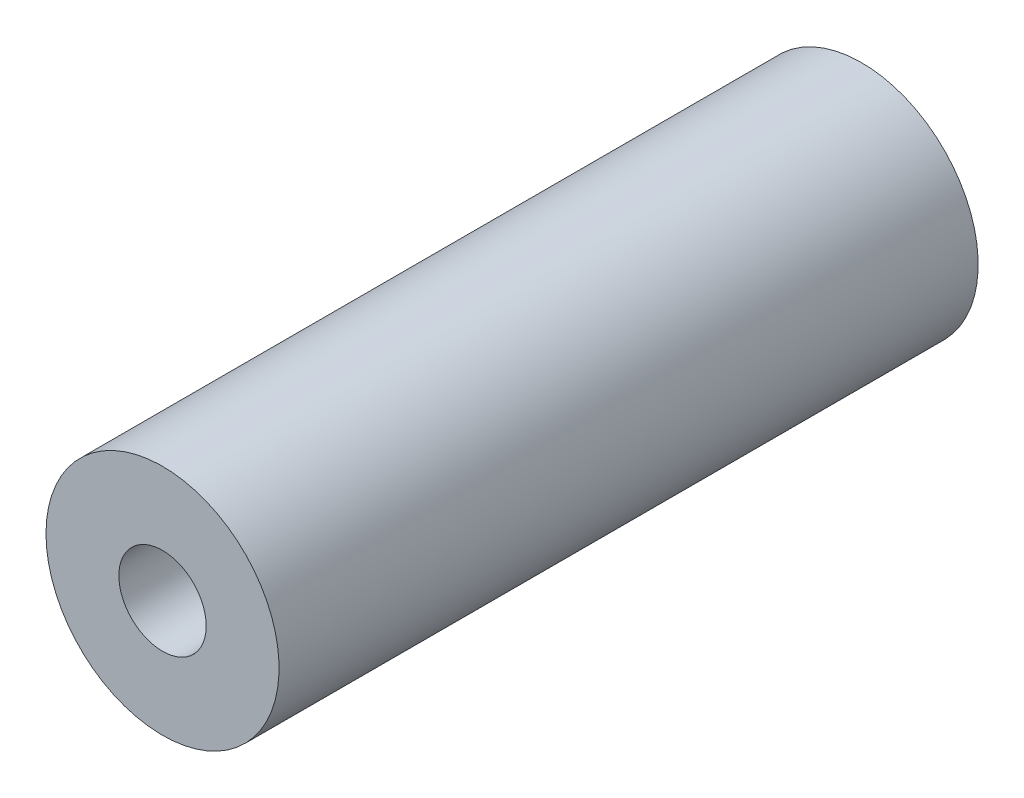
ISO-10303-21;
HEADER;
FILE_DESCRIPTION(('STEP AP214'),'2;1');
FILE_NAME('part.step','',(''),(''),'','','');
FILE_SCHEMA(('AUTOMOTIVE_DESIGN { 1 0 10303 214 1 1 1 1 }'));
ENDSEC;
DATA;
#1=APPLICATION_CONTEXT('core data for automotive mechanical design processes');
#2=APPLICATION_PROTOCOL_DEFINITION('international standard','automotive_design',2000,#1);
#3=PRODUCT_CONTEXT('',#1,'mechanical');
#4=PRODUCT('Part','Part','',(#3));
#5=PRODUCT_RELATED_PRODUCT_CATEGORY('part','',(#4));
#6=PRODUCT_DEFINITION_FORMATION('','',#4);
#7=PRODUCT_DEFINITION_CONTEXT('part definition',#1,'design');
#8=PRODUCT_DEFINITION('design','',#6,#7);
#9=PRODUCT_DEFINITION_SHAPE('','',#8);
#10=(LENGTH_UNIT() NAMED_UNIT(*) SI_UNIT(.MILLI.,.METRE.));
#11=(NAMED_UNIT(*) PLANE_ANGLE_UNIT() SI_UNIT($,.RADIAN.));
#12=(NAMED_UNIT(*) SI_UNIT($,.STERADIAN.) SOLID_ANGLE_UNIT());
#13=UNCERTAINTY_MEASURE_WITH_UNIT(LENGTH_MEASURE(1.E-05),#10,'distance_accuracy_value','');
#14=(GEOMETRIC_REPRESENTATION_CONTEXT(3) GLOBAL_UNCERTAINTY_ASSIGNED_CONTEXT((#13)) GLOBAL_UNIT_ASSIGNED_CONTEXT((#10,
#11,#12)) REPRESENTATION_CONTEXT('',''));
#15=CARTESIAN_POINT('',(0.,0.,0.));
#16=DIRECTION('',(0.,0.,1.));
#17=DIRECTION('',(1.,0.,0.));
#18=AXIS2_PLACEMENT_3D('',#15,#16,#17);
#19=CARTESIAN_POINT('',(0.,0.,19.05));
#20=DIRECTION('',(0.,0.,-1.));
#21=DIRECTION('',(-1.,0.,0.));
#22=AXIS2_PLACEMENT_3D('',#19,#20,#21);
#23=CYLINDRICAL_SURFACE('',#22,3.175);
#24=CARTESIAN_POINT('',(0.,0.,19.05));
#25=DIRECTION('',(0.,0.,1.));
#26=DIRECTION('',(1.,0.,0.));
#27=AXIS2_PLACEMENT_3D('',#24,#25,#26);
#28=CIRCLE('',#27,3.175);
#29=CARTESIAN_POINT('',(-3.175,0.,19.05));
#30=VERTEX_POINT('',#29);
#31=EDGE_CURVE('E11',#30,#30,#28,.T.);
#32=CARTESIAN_POINT('',(0.,0.,0.));
#33=DIRECTION('',(0.,0.,1.));
#34=DIRECTION('',(1.,0.,0.));
#35=AXIS2_PLACEMENT_3D('',#32,#33,#34);
#36=CIRCLE('',#35,3.175);
#37=CARTESIAN_POINT('',(-3.175,0.,0.));
#38=VERTEX_POINT('',#37);
#39=EDGE_CURVE('E36',#38,#38,#36,.T.);
#40=CARTESIAN_POINT('',(-3.175,0.,19.05));
#41=CARTESIAN_POINT('',(-3.175,0.,18.8515625));
#42=CARTESIAN_POINT('',(-3.175,0.,18.653125));
#43=CARTESIAN_POINT('',(-3.175,0.,18.25625));
#44=CARTESIAN_POINT('',(-3.175,0.,18.0578125));
#45=CARTESIAN_POINT('',(-3.175,0.,17.6609375));
#46=CARTESIAN_POINT('',(-3.175,0.,17.4625));
#47=CARTESIAN_POINT('',(-3.175,0.,17.065625));
#48=CARTESIAN_POINT('',(-3.175,0.,16.8671875));
#49=CARTESIAN_POINT('',(-3.175,0.,16.4703125));
#50=CARTESIAN_POINT('',(-3.175,0.,16.271875));
#51=CARTESIAN_POINT('',(-3.175,0.,15.875));
#52=CARTESIAN_POINT('',(-3.175,0.,15.6765625));
#53=CARTESIAN_POINT('',(-3.175,0.,15.2796875));
#54=CARTESIAN_POINT('',(-3.175,0.,15.08125));
#55=CARTESIAN_POINT('',(-3.175,0.,14.684375));
#56=CARTESIAN_POINT('',(-3.175,0.,14.4859375));
#57=CARTESIAN_POINT('',(-3.175,0.,14.0890625));
#58=CARTESIAN_POINT('',(-3.175,0.,13.890625));
#59=CARTESIAN_POINT('',(-3.175,0.,13.49375));
#60=CARTESIAN_POINT('',(-3.175,0.,13.2953125));
#61=CARTESIAN_POINT('',(-3.175,0.,12.8984375));
#62=CARTESIAN_POINT('',(-3.175,0.,12.7));
#63=CARTESIAN_POINT('',(-3.175,0.,12.303125));
#64=CARTESIAN_POINT('',(-3.175,0.,12.1046875));
#65=CARTESIAN_POINT('',(-3.175,0.,11.7078125));
#66=CARTESIAN_POINT('',(-3.175,0.,11.509375));
#67=CARTESIAN_POINT('',(-3.175,0.,11.1125));
#68=CARTESIAN_POINT('',(-3.175,0.,10.9140625));
#69=CARTESIAN_POINT('',(-3.175,0.,10.5171875));
#70=CARTESIAN_POINT('',(-3.175,0.,10.31875));
#71=CARTESIAN_POINT('',(-3.175,0.,9.921875));
#72=CARTESIAN_POINT('',(-3.175,0.,9.7234375));
#73=CARTESIAN_POINT('',(-3.175,0.,9.3265625));
#74=CARTESIAN_POINT('',(-3.175,0.,9.128125));
#75=CARTESIAN_POINT('',(-3.175,0.,8.73125));
#76=CARTESIAN_POINT('',(-3.175,0.,8.5328125));
#77=CARTESIAN_POINT('',(-3.175,0.,8.1359375));
#78=CARTESIAN_POINT('',(-3.175,0.,7.9375));
#79=CARTESIAN_POINT('',(-3.175,0.,7.540625));
#80=CARTESIAN_POINT('',(-3.175,0.,7.3421875));
#81=CARTESIAN_POINT('',(-3.175,0.,6.9453125));
#82=CARTESIAN_POINT('',(-3.175,0.,6.746875));
#83=CARTESIAN_POINT('',(-3.175,0.,6.35));
#84=CARTESIAN_POINT('',(-3.175,0.,6.1515625));
#85=CARTESIAN_POINT('',(-3.175,0.,5.7546875));
#86=CARTESIAN_POINT('',(-3.175,0.,5.55625));
#87=CARTESIAN_POINT('',(-3.175,0.,5.159375));
#88=CARTESIAN_POINT('',(-3.175,0.,4.9609375));
#89=CARTESIAN_POINT('',(-3.175,0.,4.5640625));
#90=CARTESIAN_POINT('',(-3.175,0.,4.365625));
#91=CARTESIAN_POINT('',(-3.175,0.,3.96875));
#92=CARTESIAN_POINT('',(-3.175,0.,3.7703125));
#93=CARTESIAN_POINT('',(-3.175,0.,3.3734375));
#94=CARTESIAN_POINT('',(-3.175,0.,3.175));
#95=CARTESIAN_POINT('',(-3.175,0.,2.778125));
#96=CARTESIAN_POINT('',(-3.175,0.,2.5796875));
#97=CARTESIAN_POINT('',(-3.175,0.,2.1828125));
#98=CARTESIAN_POINT('',(-3.175,0.,1.984375));
#99=CARTESIAN_POINT('',(-3.175,0.,1.5875));
#100=CARTESIAN_POINT('',(-3.175,0.,1.3890625));
#101=CARTESIAN_POINT('',(-3.175,0.,0.992187500000001));
#102=CARTESIAN_POINT('',(-3.175,0.,0.793750000000001));
#103=CARTESIAN_POINT('',(-3.175,0.,0.396875));
#104=CARTESIAN_POINT('',(-3.175,0.,0.1984375));
#105=CARTESIAN_POINT('',(-3.175,0.,0.));
#106=B_SPLINE_CURVE_WITH_KNOTS('',3,(#40,#41,#42,#43,#44,#45,#46,#47,#48,#49,#50,#51,#52,#53,
#54,#55,#56,#57,#58,#59,#60,#61,#62,#63,#64,#65,#66,#67,#68,#69,#70,#71,#72,#73,#74,#75,#76,#77,
#78,#79,#80,#81,#82,#83,#84,#85,#86,#87,#88,#89,#90,#91,#92,#93,#94,#95,#96,#97,#98,#99,#100,
#101,#102,#103,#104,#105),.UNSPECIFIED.,.F.,.F.,(4,2,2,2,2,2,2,2,2,2,2,2,2,2,2,2,2,2,2,2,2,2,2,
2,2,2,2,2,2,2,2,2,4),(0.,0.595312499999997,1.190625,1.7859375,2.38125,2.9765625,3.571875,
4.1671875,4.7625,5.3578125,5.953125,6.5484375,7.14375,7.7390625,8.334375,8.9296875,9.525,
10.1203125,10.715625,11.3109375,11.90625,12.5015625,13.096875,13.6921875,14.2875,14.8828125,
15.478125,16.0734375,16.66875,17.2640625,17.859375,18.4546875,19.05),.UNSPECIFIED.);
#107=EDGE_CURVE('BSEAM33',#30,#38,#106,.T.);
#108=ORIENTED_EDGE('',*,*,#31,.F.);
#109=ORIENTED_EDGE('',*,*,#39,.T.);
#110=ORIENTED_EDGE('',*,*,#107,.T.);
#111=ORIENTED_EDGE('',*,*,#107,.F.);
#112=EDGE_LOOP('',(#108,#110,#109,#111));
#113=FACE_BOUND('',#112,.T.);
#114=ADVANCED_FACE('F33',(#113),#23,.T.);
#115=CARTESIAN_POINT('',(0.,0.,19.05));
#116=DIRECTION('',(0.,0.,1.));
#117=DIRECTION('',(1.,0.,0.));
#118=AXIS2_PLACEMENT_3D('',#115,#116,#117);
#119=PLANE('',#118);
#120=CARTESIAN_POINT('',(0.,0.,19.05));
#121=DIRECTION('',(0.,0.,1.));
#122=DIRECTION('',(1.,0.,0.));
#123=AXIS2_PLACEMENT_3D('',#120,#121,#122);
#124=CIRCLE('',#123,1.190625);
#125=CARTESIAN_POINT('',(1.190625,0.,19.05));
#126=VERTEX_POINT('',#125);
#127=EDGE_CURVE('E47',#126,#126,#124,.T.);
#128=ORIENTED_EDGE('',*,*,#127,.F.);
#129=EDGE_LOOP('',(#128));
#130=FACE_BOUND('',#129,.T.);
#131=ORIENTED_EDGE('',*,*,#31,.T.);
#132=EDGE_LOOP('',(#131));
#133=FACE_BOUND('',#132,.T.);
#134=ADVANCED_FACE('F53',(#130,#133),#119,.T.);
#135=CARTESIAN_POINT('',(0.,0.,0.));
#136=DIRECTION('',(0.,0.,1.));
#137=DIRECTION('',(1.,0.,0.));
#138=AXIS2_PLACEMENT_3D('',#135,#136,#137);
#139=PLANE('',#138);
#140=ORIENTED_EDGE('',*,*,#39,.F.);
#141=EDGE_LOOP('',(#140));
#142=FACE_BOUND('',#141,.T.);
#143=ADVANCED_FACE('F55',(#142),#139,.F.);
#144=CARTESIAN_POINT('',(0.,0.,2.98240395459907));
#145=DIRECTION('',(0.,0.,1.));
#146=DIRECTION('',(1.,0.,0.));
#147=AXIS2_PLACEMENT_3D('',#144,#145,#146);
#148=CYLINDRICAL_SURFACE('',#147,1.190625);
#149=CARTESIAN_POINT('',(0.,0.,12.7));
#150=DIRECTION('',(0.,0.,1.));
#151=DIRECTION('',(1.,0.,0.));
#152=AXIS2_PLACEMENT_3D('',#149,#150,#151);
#153=CIRCLE('',#152,1.190625);
#154=CARTESIAN_POINT('',(1.190625,0.,12.7));
#155=VERTEX_POINT('',#154);
#156=EDGE_CURVE('E43',#155,#155,#153,.F.);
#157=ORIENTED_EDGE('',*,*,#156,.T.);
#158=EDGE_LOOP('',(#157));
#159=FACE_BOUND('',#158,.T.);
#160=ORIENTED_EDGE('',*,*,#127,.T.);
#161=EDGE_LOOP('',(#160));
#162=FACE_BOUND('',#161,.T.);
#163=ADVANCED_FACE('F51',(#159,#162),#148,.F.);
#164=CARTESIAN_POINT('',(0.,0.,12.7));
#165=DIRECTION('',(0.,0.,1.));
#166=DIRECTION('',(1.,0.,0.));
#167=AXIS2_PLACEMENT_3D('',#164,#165,#166);
#168=PLANE('',#167);
#169=ORIENTED_EDGE('',*,*,#156,.F.);
#170=EDGE_LOOP('',(#169));
#171=FACE_BOUND('',#170,.T.);
#172=ADVANCED_FACE('F66',(#171),#168,.T.);
#173=CLOSED_SHELL('',(#114,#134,#143,#163,#172));
#174=MANIFOLD_SOLID_BREP('B2',#173);
#175=ADVANCED_BREP_SHAPE_REPRESENTATION('',(#18,#174),#14);
#176=SHAPE_DEFINITION_REPRESENTATION(#9,#175);
ENDSEC;
END-ISO-10303-21;
